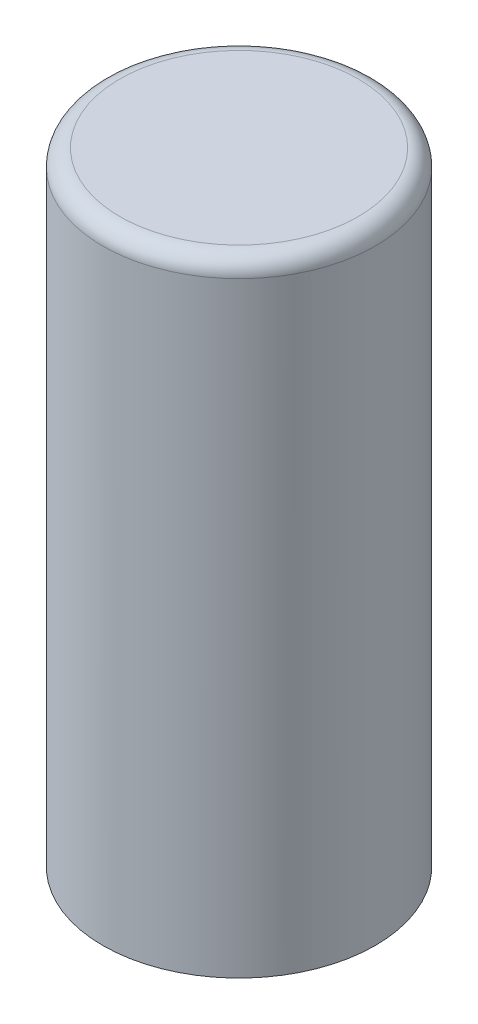
ISO-10303-21;
HEADER;
FILE_DESCRIPTION(('STEP AP214'),'2;1');
FILE_NAME('part.step','',(''),(''),'','','');
FILE_SCHEMA(('AUTOMOTIVE_DESIGN { 1 0 10303 214 1 1 1 1 }'));
ENDSEC;
DATA;
#1=APPLICATION_CONTEXT('core data for automotive mechanical design processes');
#2=APPLICATION_PROTOCOL_DEFINITION('international standard','automotive_design',2000,#1);
#3=PRODUCT_CONTEXT('',#1,'mechanical');
#4=PRODUCT('Part','Part','',(#3));
#5=PRODUCT_RELATED_PRODUCT_CATEGORY('part','',(#4));
#6=PRODUCT_DEFINITION_FORMATION('','',#4);
#7=PRODUCT_DEFINITION_CONTEXT('part definition',#1,'design');
#8=PRODUCT_DEFINITION('design','',#6,#7);
#9=PRODUCT_DEFINITION_SHAPE('','',#8);
#10=(LENGTH_UNIT() NAMED_UNIT(*) SI_UNIT(.MILLI.,.METRE.));
#11=(NAMED_UNIT(*) PLANE_ANGLE_UNIT() SI_UNIT($,.RADIAN.));
#12=(NAMED_UNIT(*) SI_UNIT($,.STERADIAN.) SOLID_ANGLE_UNIT());
#13=UNCERTAINTY_MEASURE_WITH_UNIT(LENGTH_MEASURE(1.E-05),#10,'distance_accuracy_value','');
#14=(GEOMETRIC_REPRESENTATION_CONTEXT(3) GLOBAL_UNCERTAINTY_ASSIGNED_CONTEXT((#13)) GLOBAL_UNIT_ASSIGNED_CONTEXT((#10,
#11,#12)) REPRESENTATION_CONTEXT('',''));
#15=CARTESIAN_POINT('',(0.,0.,0.));
#16=DIRECTION('',(0.,0.,1.));
#17=DIRECTION('',(1.,0.,0.));
#18=AXIS2_PLACEMENT_3D('',#15,#16,#17);
#19=CARTESIAN_POINT('',(0.,0.,0.));
#20=DIRECTION('',(0.,1.,0.));
#21=DIRECTION('',(0.,0.,1.));
#22=AXIS2_PLACEMENT_3D('',#19,#20,#21);
#23=PLANE('',#22);
#24=CARTESIAN_POINT('',(0.,0.,0.));
#25=DIRECTION('',(0.,1.,0.));
#26=DIRECTION('',(0.,0.,1.));
#27=AXIS2_PLACEMENT_3D('',#24,#25,#26);
#28=CIRCLE('',#27,11.9126);
#29=CARTESIAN_POINT('',(0.,0.,11.9126));
#30=VERTEX_POINT('',#29);
#31=EDGE_CURVE('E49',#30,#30,#28,.T.);
#32=ORIENTED_EDGE('',*,*,#31,.T.);
#33=EDGE_LOOP('',(#32));
#34=FACE_BOUND('',#33,.T.);
#35=CARTESIAN_POINT('',(0.,0.,0.));
#36=DIRECTION('',(0.,1.,0.));
#37=DIRECTION('',(0.,0.,1.));
#38=AXIS2_PLACEMENT_3D('',#35,#36,#37);
#39=CIRCLE('',#38,12.7);
#40=CARTESIAN_POINT('',(0.,0.,12.7));
#41=VERTEX_POINT('',#40);
#42=EDGE_CURVE('E42',#41,#41,#39,.T.);
#43=ORIENTED_EDGE('',*,*,#42,.F.);
#44=EDGE_LOOP('',(#43));
#45=FACE_BOUND('',#44,.T.);
#46=ADVANCED_FACE('F31',(#34,#45),#23,.F.);
#47=CARTESIAN_POINT('',(0.,226.167024484277,0.));
#48=DIRECTION('',(0.,-1.,0.));
#49=DIRECTION('',(0.,0.,-1.));
#50=AXIS2_PLACEMENT_3D('',#47,#48,#49);
#51=CYLINDRICAL_SURFACE('',#50,12.7);
#52=CARTESIAN_POINT('',(0.,56.4515,0.));
#53=DIRECTION('',(0.,-1.,0.));
#54=DIRECTION('',(0.,0.,-1.));
#55=AXIS2_PLACEMENT_3D('',#52,#53,#54);
#56=CIRCLE('',#55,12.7);
#57=CARTESIAN_POINT('',(0.,56.4515,-12.7));
#58=VERTEX_POINT('',#57);
#59=EDGE_CURVE('E38',#58,#58,#56,.T.);
#60=ORIENTED_EDGE('',*,*,#59,.T.);
#61=EDGE_LOOP('',(#60));
#62=FACE_BOUND('',#61,.T.);
#63=ORIENTED_EDGE('',*,*,#42,.T.);
#64=EDGE_LOOP('',(#63));
#65=FACE_BOUND('',#64,.T.);
#66=ADVANCED_FACE('F69',(#62,#65),#51,.T.);
#67=CARTESIAN_POINT('',(0.,58.039,0.));
#68=DIRECTION('',(0.,-1.,0.));
#69=DIRECTION('',(-0.369959482981418,0.,0.929047889482626));
#70=AXIS2_PLACEMENT_3D('',#67,#68,#69);
#71=PLANE('',#70);
#72=CARTESIAN_POINT('',(0.,58.039,0.));
#73=DIRECTION('',(0.,-1.,0.));
#74=DIRECTION('',(0.,0.,-1.));
#75=AXIS2_PLACEMENT_3D('',#72,#73,#74);
#76=CIRCLE('',#75,11.1125);
#77=CARTESIAN_POINT('',(0.,58.039,-11.1125));
#78=VERTEX_POINT('',#77);
#79=EDGE_CURVE('E10',#78,#78,#76,.F.);
#80=ORIENTED_EDGE('',*,*,#79,.T.);
#81=EDGE_LOOP('',(#80));
#82=FACE_BOUND('',#81,.T.);
#83=ADVANCED_FACE('F74',(#82),#71,.F.);
#84=CARTESIAN_POINT('',(0.,56.4515,0.));
#85=DIRECTION('',(0.,-1.,0.));
#86=DIRECTION('',(0.,0.,-1.));
#87=AXIS2_PLACEMENT_3D('',#84,#85,#86);
#88=TOROIDAL_SURFACE('',#87,11.1125,1.5875);
#89=ORIENTED_EDGE('',*,*,#79,.F.);
#90=EDGE_LOOP('',(#89));
#91=FACE_BOUND('',#90,.T.);
#92=ORIENTED_EDGE('',*,*,#59,.F.);
#93=EDGE_LOOP('',(#92));
#94=FACE_BOUND('',#93,.T.);
#95=ADVANCED_FACE('F33',(#91,#94),#88,.T.);
#96=CARTESIAN_POINT('',(0.,226.167024484277,0.));
#97=DIRECTION('',(0.,-1.,0.));
#98=DIRECTION('',(0.,0.,-1.));
#99=AXIS2_PLACEMENT_3D('',#96,#97,#98);
#100=CYLINDRICAL_SURFACE('',#99,11.9126);
#101=CARTESIAN_POINT('',(0.,56.4515,0.));
#102=DIRECTION('',(0.,-1.,0.));
#103=DIRECTION('',(0.,0.,-1.));
#104=AXIS2_PLACEMENT_3D('',#101,#102,#103);
#105=CIRCLE('',#104,11.9126);
#106=CARTESIAN_POINT('',(0.,56.4515,-11.9126));
#107=VERTEX_POINT('',#106);
#108=EDGE_CURVE('E52',#107,#107,#105,.T.);
#109=ORIENTED_EDGE('',*,*,#108,.F.);
#110=EDGE_LOOP('',(#109));
#111=FACE_BOUND('',#110,.T.);
#112=ORIENTED_EDGE('',*,*,#31,.F.);
#113=EDGE_LOOP('',(#112));
#114=FACE_BOUND('',#113,.T.);
#115=ADVANCED_FACE('F60',(#111,#114),#100,.F.);
#116=CARTESIAN_POINT('',(0.,57.2516,0.));
#117=DIRECTION('',(0.,-1.,0.));
#118=DIRECTION('',(-0.369959482981418,0.,0.929047889482626));
#119=AXIS2_PLACEMENT_3D('',#116,#117,#118);
#120=PLANE('',#119);
#121=CARTESIAN_POINT('',(0.,57.2516,0.));
#122=DIRECTION('',(0.,-1.,0.));
#123=DIRECTION('',(0.,0.,-1.));
#124=AXIS2_PLACEMENT_3D('',#121,#122,#123);
#125=CIRCLE('',#124,11.1125);
#126=CARTESIAN_POINT('',(0.,57.2516,-11.1125));
#127=VERTEX_POINT('',#126);
#128=EDGE_CURVE('E46',#127,#127,#125,.F.);
#129=ORIENTED_EDGE('',*,*,#128,.F.);
#130=EDGE_LOOP('',(#129));
#131=FACE_BOUND('',#130,.T.);
#132=ADVANCED_FACE('F63',(#131),#120,.T.);
#133=CARTESIAN_POINT('',(0.,56.4515,0.));
#134=DIRECTION('',(0.,-1.,0.));
#135=DIRECTION('',(0.,0.,-1.));
#136=AXIS2_PLACEMENT_3D('',#133,#134,#135);
#137=TOROIDAL_SURFACE('',#136,11.1125,0.8001);
#138=ORIENTED_EDGE('',*,*,#128,.T.);
#139=EDGE_LOOP('',(#138));
#140=FACE_BOUND('',#139,.T.);
#141=ORIENTED_EDGE('',*,*,#108,.T.);
#142=EDGE_LOOP('',(#141));
#143=FACE_BOUND('',#142,.T.);
#144=ADVANCED_FACE('F58',(#140,#143),#137,.F.);
#145=CLOSED_SHELL('',(#46,#66,#83,#95,#115,#132,#144));
#146=MANIFOLD_SOLID_BREP('B2',#145);
#147=ADVANCED_BREP_SHAPE_REPRESENTATION('',(#18,#146),#14);
#148=SHAPE_DEFINITION_REPRESENTATION(#9,#147);
ENDSEC;
END-ISO-10303-21;
